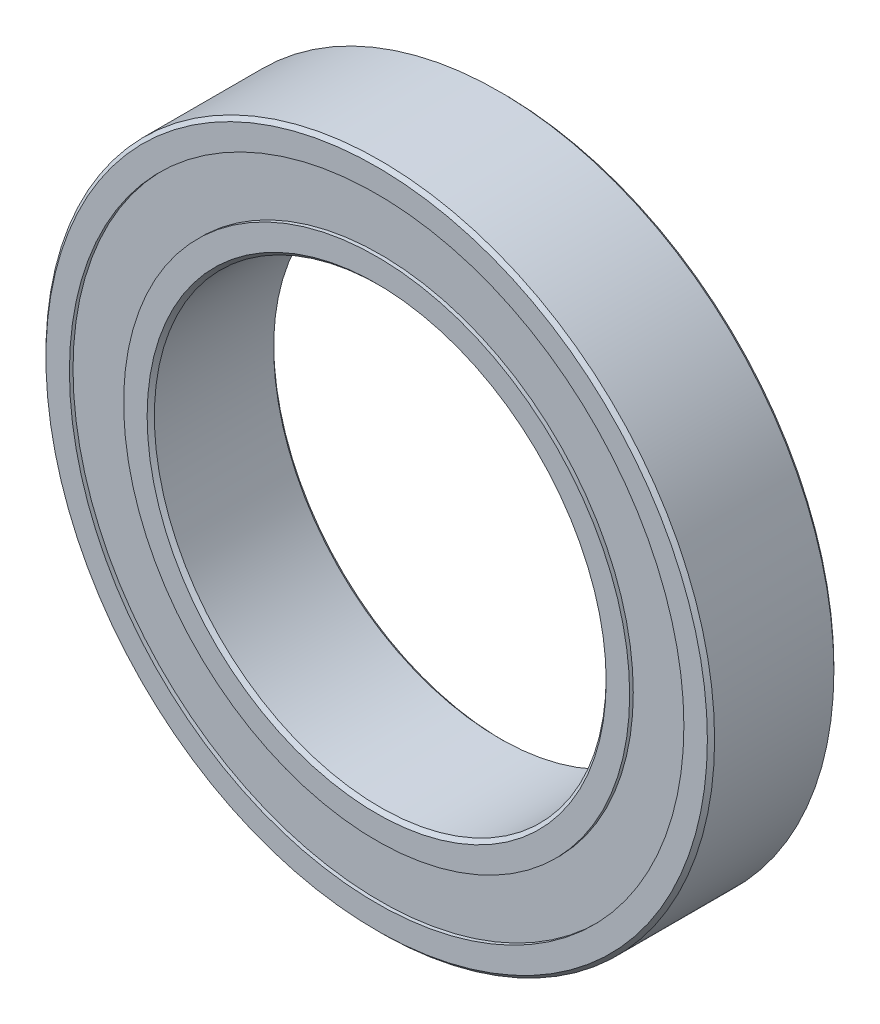
ISO-10303-21;
HEADER;
FILE_DESCRIPTION(('STEP AP214'),'2;1');
FILE_NAME('part.step','',(''),(''),'','','');
FILE_SCHEMA(('AUTOMOTIVE_DESIGN { 1 0 10303 214 1 1 1 1 }'));
ENDSEC;
DATA;
#1=APPLICATION_CONTEXT('core data for automotive mechanical design processes');
#2=APPLICATION_PROTOCOL_DEFINITION('international standard','automotive_design',2000,#1);
#3=PRODUCT_CONTEXT('',#1,'mechanical');
#4=PRODUCT('Part','Part','',(#3));
#5=PRODUCT_RELATED_PRODUCT_CATEGORY('part','',(#4));
#6=PRODUCT_DEFINITION_FORMATION('','',#4);
#7=PRODUCT_DEFINITION_CONTEXT('part definition',#1,'design');
#8=PRODUCT_DEFINITION('design','',#6,#7);
#9=PRODUCT_DEFINITION_SHAPE('','',#8);
#10=(LENGTH_UNIT() NAMED_UNIT(*) SI_UNIT(.MILLI.,.METRE.));
#11=(NAMED_UNIT(*) PLANE_ANGLE_UNIT() SI_UNIT($,.RADIAN.));
#12=(NAMED_UNIT(*) SI_UNIT($,.STERADIAN.) SOLID_ANGLE_UNIT());
#13=UNCERTAINTY_MEASURE_WITH_UNIT(LENGTH_MEASURE(1.E-05),#10,'distance_accuracy_value','');
#14=(GEOMETRIC_REPRESENTATION_CONTEXT(3) GLOBAL_UNCERTAINTY_ASSIGNED_CONTEXT((#13)) GLOBAL_UNIT_ASSIGNED_CONTEXT((#10,
#11,#12)) REPRESENTATION_CONTEXT('',''));
#15=CARTESIAN_POINT('',(0.,0.,0.));
#16=DIRECTION('',(0.,0.,1.));
#17=DIRECTION('',(1.,0.,0.));
#18=AXIS2_PLACEMENT_3D('',#15,#16,#17);
#19=CARTESIAN_POINT('',(-28.9805214852095,10.4269925504923,0.2));
#20=DIRECTION('',(0.,0.,1.));
#21=DIRECTION('',(1.,0.,0.));
#22=AXIS2_PLACEMENT_3D('',#19,#20,#21);
#23=CONICAL_SURFACE('',#22,18.5,0.785398163397446);
#24=CARTESIAN_POINT('',(-28.9805214852095,10.4269925504923,0.2));
#25=DIRECTION('',(0.,0.,1.));
#26=DIRECTION('',(1.,0.,0.));
#27=AXIS2_PLACEMENT_3D('',#24,#25,#26);
#28=CIRCLE('',#27,18.5);
#29=CARTESIAN_POINT('',(-10.4805214852095,10.4269925504923,0.2));
#30=VERTEX_POINT('',#29);
#31=EDGE_CURVE('E80',#30,#30,#28,.T.);
#32=ORIENTED_EDGE('',*,*,#31,.F.);
#33=EDGE_LOOP('',(#32));
#34=FACE_BOUND('',#33,.T.);
#35=CARTESIAN_POINT('',(-28.9805214852095,10.4269925504923,0.));
#36=DIRECTION('',(0.,0.,-1.));
#37=DIRECTION('',(1.,0.,0.));
#38=AXIS2_PLACEMENT_3D('',#35,#36,#37);
#39=CIRCLE('',#38,18.3);
#40=CARTESIAN_POINT('',(-10.6805214852095,10.4269925504923,0.));
#41=VERTEX_POINT('',#40);
#42=EDGE_CURVE('E125',#41,#41,#39,.T.);
#43=ORIENTED_EDGE('',*,*,#42,.F.);
#44=EDGE_LOOP('',(#43));
#45=FACE_BOUND('',#44,.T.);
#46=ADVANCED_FACE('F17',(#34,#45),#23,.T.);
#47=CARTESIAN_POINT('',(-28.9805214852095,10.4269925504923,7.));
#48=DIRECTION('',(0.,0.,-1.));
#49=DIRECTION('',(-1.,0.,0.));
#50=AXIS2_PLACEMENT_3D('',#47,#48,#49);
#51=CONICAL_SURFACE('',#50,18.3,0.785398163397446);
#52=CARTESIAN_POINT('',(-28.9805214852095,10.4269925504923,7.));
#53=DIRECTION('',(0.,0.,1.));
#54=DIRECTION('',(1.,0.,0.));
#55=AXIS2_PLACEMENT_3D('',#52,#53,#54);
#56=CIRCLE('',#55,18.3);
#57=CARTESIAN_POINT('',(-10.6805214852095,10.4269925504923,7.));
#58=VERTEX_POINT('',#57);
#59=EDGE_CURVE('E70',#58,#58,#56,.T.);
#60=ORIENTED_EDGE('',*,*,#59,.F.);
#61=EDGE_LOOP('',(#60));
#62=FACE_BOUND('',#61,.T.);
#63=CARTESIAN_POINT('',(-28.9805214852095,10.4269925504923,6.8));
#64=DIRECTION('',(0.,0.,-1.));
#65=DIRECTION('',(1.,0.,0.));
#66=AXIS2_PLACEMENT_3D('',#63,#64,#65);
#67=CIRCLE('',#66,18.5);
#68=CARTESIAN_POINT('',(-10.4805214852095,10.4269925504923,6.8));
#69=VERTEX_POINT('',#68);
#70=EDGE_CURVE('E21',#69,#69,#67,.T.);
#71=ORIENTED_EDGE('',*,*,#70,.F.);
#72=EDGE_LOOP('',(#71));
#73=FACE_BOUND('',#72,.T.);
#74=ADVANCED_FACE('F176',(#62,#73),#51,.T.);
#75=CARTESIAN_POINT('',(-28.9805214852095,10.4269925504923,0.));
#76=DIRECTION('',(0.,0.,-1.));
#77=DIRECTION('',(-1.,0.,0.));
#78=AXIS2_PLACEMENT_3D('',#75,#76,#77);
#79=CONICAL_SURFACE('',#78,12.7,0.785398163397459);
#80=CARTESIAN_POINT('',(-28.9805214852095,10.4269925504923,0.));
#81=DIRECTION('',(0.,0.,1.));
#82=DIRECTION('',(1.,0.,0.));
#83=AXIS2_PLACEMENT_3D('',#80,#81,#82);
#84=CIRCLE('',#83,12.7);
#85=CARTESIAN_POINT('',(-16.2805214852095,10.4269925504923,0.));
#86=VERTEX_POINT('',#85);
#87=EDGE_CURVE('E144',#86,#86,#84,.T.);
#88=ORIENTED_EDGE('',*,*,#87,.F.);
#89=EDGE_LOOP('',(#88));
#90=FACE_BOUND('',#89,.T.);
#91=CARTESIAN_POINT('',(-28.9805214852095,10.4269925504923,0.2));
#92=DIRECTION('',(0.,0.,-1.));
#93=DIRECTION('',(1.,0.,0.));
#94=AXIS2_PLACEMENT_3D('',#91,#92,#93);
#95=CIRCLE('',#94,12.5);
#96=CARTESIAN_POINT('',(-16.4805214852095,10.4269925504923,0.2));
#97=VERTEX_POINT('',#96);
#98=EDGE_CURVE('E117',#97,#97,#95,.T.);
#99=ORIENTED_EDGE('',*,*,#98,.F.);
#100=EDGE_LOOP('',(#99));
#101=FACE_BOUND('',#100,.T.);
#102=ADVANCED_FACE('F171',(#90,#101),#79,.F.);
#103=CARTESIAN_POINT('',(-28.9805214852095,10.4269925504923,6.8));
#104=DIRECTION('',(0.,0.,1.));
#105=DIRECTION('',(1.,0.,0.));
#106=AXIS2_PLACEMENT_3D('',#103,#104,#105);
#107=CONICAL_SURFACE('',#106,12.5,0.785398163397459);
#108=CARTESIAN_POINT('',(-28.9805214852095,10.4269925504923,6.8));
#109=DIRECTION('',(0.,0.,1.));
#110=DIRECTION('',(1.,0.,0.));
#111=AXIS2_PLACEMENT_3D('',#108,#109,#110);
#112=CIRCLE('',#111,12.5);
#113=CARTESIAN_POINT('',(-16.4805214852095,10.4269925504923,6.8));
#114=VERTEX_POINT('',#113);
#115=EDGE_CURVE('E109',#114,#114,#112,.T.);
#116=ORIENTED_EDGE('',*,*,#115,.F.);
#117=EDGE_LOOP('',(#116));
#118=FACE_BOUND('',#117,.T.);
#119=CARTESIAN_POINT('',(-28.9805214852095,10.4269925504923,7.));
#120=DIRECTION('',(0.,0.,-1.));
#121=DIRECTION('',(1.,0.,0.));
#122=AXIS2_PLACEMENT_3D('',#119,#120,#121);
#123=CIRCLE('',#122,12.7);
#124=CARTESIAN_POINT('',(-16.2805214852095,10.4269925504923,7.));
#125=VERTEX_POINT('',#124);
#126=EDGE_CURVE('E110',#125,#125,#123,.T.);
#127=ORIENTED_EDGE('',*,*,#126,.F.);
#128=EDGE_LOOP('',(#127));
#129=FACE_BOUND('',#128,.T.);
#130=ADVANCED_FACE('F163',(#118,#129),#107,.F.);
#131=CARTESIAN_POINT('',(-28.9805214852095,10.4269925504923,0.2));
#132=DIRECTION('',(0.,0.,-1.));
#133=DIRECTION('',(0.,-1.,0.));
#134=AXIS2_PLACEMENT_3D('',#131,#132,#133);
#135=PLANE('',#134);
#136=CARTESIAN_POINT('',(-28.9805214852095,10.4269925504923,0.2));
#137=DIRECTION('',(0.,0.,-1.));
#138=DIRECTION('',(-1.,0.,0.));
#139=AXIS2_PLACEMENT_3D('',#136,#137,#138);
#140=CIRCLE('',#139,17.);
#141=CARTESIAN_POINT('',(-45.9805214852095,10.4269925504923,0.2));
#142=VERTEX_POINT('',#141);
#143=EDGE_CURVE('E11',#142,#142,#140,.T.);
#144=ORIENTED_EDGE('',*,*,#143,.T.);
#145=EDGE_LOOP('',(#144));
#146=FACE_BOUND('',#145,.T.);
#147=CARTESIAN_POINT('',(-28.9805214852095,10.4269925504923,0.2));
#148=DIRECTION('',(0.,0.,-1.));
#149=DIRECTION('',(-1.,0.,0.));
#150=AXIS2_PLACEMENT_3D('',#147,#148,#149);
#151=CIRCLE('',#150,14.);
#152=CARTESIAN_POINT('',(-42.9805214852094,10.4269925504923,0.2));
#153=VERTEX_POINT('',#152);
#154=EDGE_CURVE('E28',#153,#153,#151,.T.);
#155=ORIENTED_EDGE('',*,*,#154,.F.);
#156=EDGE_LOOP('',(#155));
#157=FACE_BOUND('',#156,.T.);
#158=ADVANCED_FACE('F161',(#146,#157),#135,.T.);
#159=CARTESIAN_POINT('',(-28.9805214852095,10.4269925504923,0.2));
#160=DIRECTION('',(0.,0.,-1.));
#161=DIRECTION('',(-1.,0.,0.));
#162=AXIS2_PLACEMENT_3D('',#159,#160,#161);
#163=CYLINDRICAL_SURFACE('',#162,17.);
#164=CARTESIAN_POINT('',(-28.9805214852095,10.4269925504923,0.));
#165=DIRECTION('',(0.,0.,-1.));
#166=DIRECTION('',(-1.,0.,0.));
#167=AXIS2_PLACEMENT_3D('',#164,#165,#166);
#168=CIRCLE('',#167,17.);
#169=CARTESIAN_POINT('',(-45.9805214852095,10.4269925504923,0.));
#170=VERTEX_POINT('',#169);
#171=EDGE_CURVE('E130',#170,#170,#168,.T.);
#172=ORIENTED_EDGE('',*,*,#171,.T.);
#173=EDGE_LOOP('',(#172));
#174=FACE_BOUND('',#173,.T.);
#175=ORIENTED_EDGE('',*,*,#143,.F.);
#176=EDGE_LOOP('',(#175));
#177=FACE_BOUND('',#176,.T.);
#178=ADVANCED_FACE('F157',(#174,#177),#163,.F.);
#179=CARTESIAN_POINT('',(-28.9805214852095,10.4269925504923,0.2));
#180=DIRECTION('',(0.,0.,-1.));
#181=DIRECTION('',(-1.,0.,0.));
#182=AXIS2_PLACEMENT_3D('',#179,#180,#181);
#183=CYLINDRICAL_SURFACE('',#182,14.);
#184=CARTESIAN_POINT('',(-28.9805214852095,10.4269925504923,0.));
#185=DIRECTION('',(0.,0.,-1.));
#186=DIRECTION('',(-1.,0.,0.));
#187=AXIS2_PLACEMENT_3D('',#184,#185,#186);
#188=CIRCLE('',#187,14.);
#189=CARTESIAN_POINT('',(-42.9805214852094,10.4269925504923,0.));
#190=VERTEX_POINT('',#189);
#191=EDGE_CURVE('E119',#190,#190,#188,.T.);
#192=ORIENTED_EDGE('',*,*,#191,.F.);
#193=EDGE_LOOP('',(#192));
#194=FACE_BOUND('',#193,.T.);
#195=ORIENTED_EDGE('',*,*,#154,.T.);
#196=EDGE_LOOP('',(#195));
#197=FACE_BOUND('',#196,.T.);
#198=ADVANCED_FACE('F154',(#194,#197),#183,.T.);
#199=CARTESIAN_POINT('',(-28.9805214852095,10.4269925504923,6.8));
#200=DIRECTION('',(0.,0.,1.));
#201=DIRECTION('',(1.,0.,0.));
#202=AXIS2_PLACEMENT_3D('',#199,#200,#201);
#203=PLANE('',#202);
#204=CARTESIAN_POINT('',(-28.9805214852095,10.4269925504923,6.8));
#205=DIRECTION('',(0.,0.,1.));
#206=DIRECTION('',(1.,0.,0.));
#207=AXIS2_PLACEMENT_3D('',#204,#205,#206);
#208=CIRCLE('',#207,17.);
#209=CARTESIAN_POINT('',(-11.9805214852094,10.4269925504923,6.8));
#210=VERTEX_POINT('',#209);
#211=EDGE_CURVE('E122',#210,#210,#208,.T.);
#212=ORIENTED_EDGE('',*,*,#211,.T.);
#213=EDGE_LOOP('',(#212));
#214=FACE_BOUND('',#213,.T.);
#215=CARTESIAN_POINT('',(-28.9805214852095,10.4269925504923,6.8));
#216=DIRECTION('',(0.,0.,1.));
#217=DIRECTION('',(1.,0.,0.));
#218=AXIS2_PLACEMENT_3D('',#215,#216,#217);
#219=CIRCLE('',#218,14.);
#220=CARTESIAN_POINT('',(-14.9805214852095,10.4269925504923,6.8));
#221=VERTEX_POINT('',#220);
#222=EDGE_CURVE('E208',#221,#221,#219,.T.);
#223=ORIENTED_EDGE('',*,*,#222,.F.);
#224=EDGE_LOOP('',(#223));
#225=FACE_BOUND('',#224,.T.);
#226=ADVANCED_FACE('F19',(#214,#225),#203,.T.);
#227=CARTESIAN_POINT('',(-28.9805214852095,10.4269925504923,6.8));
#228=DIRECTION('',(0.,0.,1.));
#229=DIRECTION('',(1.,0.,0.));
#230=AXIS2_PLACEMENT_3D('',#227,#228,#229);
#231=CYLINDRICAL_SURFACE('',#230,17.);
#232=CARTESIAN_POINT('',(-28.9805214852095,10.4269925504923,7.));
#233=DIRECTION('',(0.,0.,1.));
#234=DIRECTION('',(1.,0.,0.));
#235=AXIS2_PLACEMENT_3D('',#232,#233,#234);
#236=CIRCLE('',#235,17.);
#237=CARTESIAN_POINT('',(-11.9805214852094,10.4269925504923,7.));
#238=VERTEX_POINT('',#237);
#239=EDGE_CURVE('E59',#238,#238,#236,.T.);
#240=ORIENTED_EDGE('',*,*,#239,.T.);
#241=EDGE_LOOP('',(#240));
#242=FACE_BOUND('',#241,.T.);
#243=ORIENTED_EDGE('',*,*,#211,.F.);
#244=EDGE_LOOP('',(#243));
#245=FACE_BOUND('',#244,.T.);
#246=ADVANCED_FACE('F197',(#242,#245),#231,.F.);
#247=CARTESIAN_POINT('',(-28.9805214852095,10.4269925504923,6.8));
#248=DIRECTION('',(0.,0.,1.));
#249=DIRECTION('',(1.,0.,0.));
#250=AXIS2_PLACEMENT_3D('',#247,#248,#249);
#251=CYLINDRICAL_SURFACE('',#250,14.);
#252=CARTESIAN_POINT('',(-28.9805214852095,10.4269925504923,7.));
#253=DIRECTION('',(0.,0.,1.));
#254=DIRECTION('',(1.,0.,0.));
#255=AXIS2_PLACEMENT_3D('',#252,#253,#254);
#256=CIRCLE('',#255,14.);
#257=CARTESIAN_POINT('',(-14.9805214852095,10.4269925504923,7.));
#258=VERTEX_POINT('',#257);
#259=EDGE_CURVE('E104',#258,#258,#256,.T.);
#260=ORIENTED_EDGE('',*,*,#259,.F.);
#261=EDGE_LOOP('',(#260));
#262=FACE_BOUND('',#261,.T.);
#263=ORIENTED_EDGE('',*,*,#222,.T.);
#264=EDGE_LOOP('',(#263));
#265=FACE_BOUND('',#264,.T.);
#266=ADVANCED_FACE('F199',(#262,#265),#251,.T.);
#267=CARTESIAN_POINT('',(-28.9805214852095,10.4269925504923,0.));
#268=DIRECTION('',(0.,0.,1.));
#269=DIRECTION('',(1.,0.,0.));
#270=AXIS2_PLACEMENT_3D('',#267,#268,#269);
#271=PLANE('',#270);
#272=ORIENTED_EDGE('',*,*,#171,.F.);
#273=EDGE_LOOP('',(#272));
#274=FACE_BOUND('',#273,.T.);
#275=ORIENTED_EDGE('',*,*,#42,.T.);
#276=EDGE_LOOP('',(#275));
#277=FACE_BOUND('',#276,.T.);
#278=ADVANCED_FACE('F190',(#274,#277),#271,.F.);
#279=CARTESIAN_POINT('',(-28.9805214852095,10.4269925504923,7.));
#280=DIRECTION('',(0.,0.,1.));
#281=DIRECTION('',(1.,0.,0.));
#282=AXIS2_PLACEMENT_3D('',#279,#280,#281);
#283=PLANE('',#282);
#284=ORIENTED_EDGE('',*,*,#239,.F.);
#285=EDGE_LOOP('',(#284));
#286=FACE_BOUND('',#285,.T.);
#287=ORIENTED_EDGE('',*,*,#59,.T.);
#288=EDGE_LOOP('',(#287));
#289=FACE_BOUND('',#288,.T.);
#290=ADVANCED_FACE('F186',(#286,#289),#283,.T.);
#291=CARTESIAN_POINT('',(-28.9805214852095,10.4269925504923,7.));
#292=DIRECTION('',(0.,0.,-1.));
#293=DIRECTION('',(-1.,0.,0.));
#294=AXIS2_PLACEMENT_3D('',#291,#292,#293);
#295=CYLINDRICAL_SURFACE('',#294,18.5);
#296=ORIENTED_EDGE('',*,*,#31,.T.);
#297=EDGE_LOOP('',(#296));
#298=FACE_BOUND('',#297,.T.);
#299=ORIENTED_EDGE('',*,*,#70,.T.);
#300=EDGE_LOOP('',(#299));
#301=FACE_BOUND('',#300,.T.);
#302=ADVANCED_FACE('F189',(#298,#301),#295,.T.);
#303=CARTESIAN_POINT('',(-28.9805214852095,10.4269925504923,7.));
#304=DIRECTION('',(0.,0.,-1.));
#305=DIRECTION('',(-1.,0.,0.));
#306=AXIS2_PLACEMENT_3D('',#303,#304,#305);
#307=CYLINDRICAL_SURFACE('',#306,12.5);
#308=ORIENTED_EDGE('',*,*,#98,.T.);
#309=EDGE_LOOP('',(#308));
#310=FACE_BOUND('',#309,.T.);
#311=ORIENTED_EDGE('',*,*,#115,.T.);
#312=EDGE_LOOP('',(#311));
#313=FACE_BOUND('',#312,.T.);
#314=ADVANCED_FACE('F194',(#310,#313),#307,.F.);
#315=CARTESIAN_POINT('',(-28.9805214852095,10.4269925504923,7.));
#316=DIRECTION('',(0.,0.,1.));
#317=DIRECTION('',(1.,0.,0.));
#318=AXIS2_PLACEMENT_3D('',#315,#316,#317);
#319=PLANE('',#318);
#320=ORIENTED_EDGE('',*,*,#259,.T.);
#321=EDGE_LOOP('',(#320));
#322=FACE_BOUND('',#321,.T.);
#323=ORIENTED_EDGE('',*,*,#126,.T.);
#324=EDGE_LOOP('',(#323));
#325=FACE_BOUND('',#324,.T.);
#326=ADVANCED_FACE('F105',(#322,#325),#319,.T.);
#327=CARTESIAN_POINT('',(-28.9805214852095,10.4269925504923,0.));
#328=DIRECTION('',(0.,0.,1.));
#329=DIRECTION('',(1.,0.,0.));
#330=AXIS2_PLACEMENT_3D('',#327,#328,#329);
#331=PLANE('',#330);
#332=ORIENTED_EDGE('',*,*,#191,.T.);
#333=EDGE_LOOP('',(#332));
#334=FACE_BOUND('',#333,.T.);
#335=ORIENTED_EDGE('',*,*,#87,.T.);
#336=EDGE_LOOP('',(#335));
#337=FACE_BOUND('',#336,.T.);
#338=ADVANCED_FACE('F151',(#334,#337),#331,.F.);
#339=CLOSED_SHELL('',(#46,#74,#102,#130,#158,#178,#198,#226,#246,#266,#278,#290,#302,#314,#326,#338));
#340=MANIFOLD_SOLID_BREP('B1',#339);
#341=ADVANCED_BREP_SHAPE_REPRESENTATION('',(#18,#340),#14);
#342=SHAPE_DEFINITION_REPRESENTATION(#9,#341);
ENDSEC;
END-ISO-10303-21;
